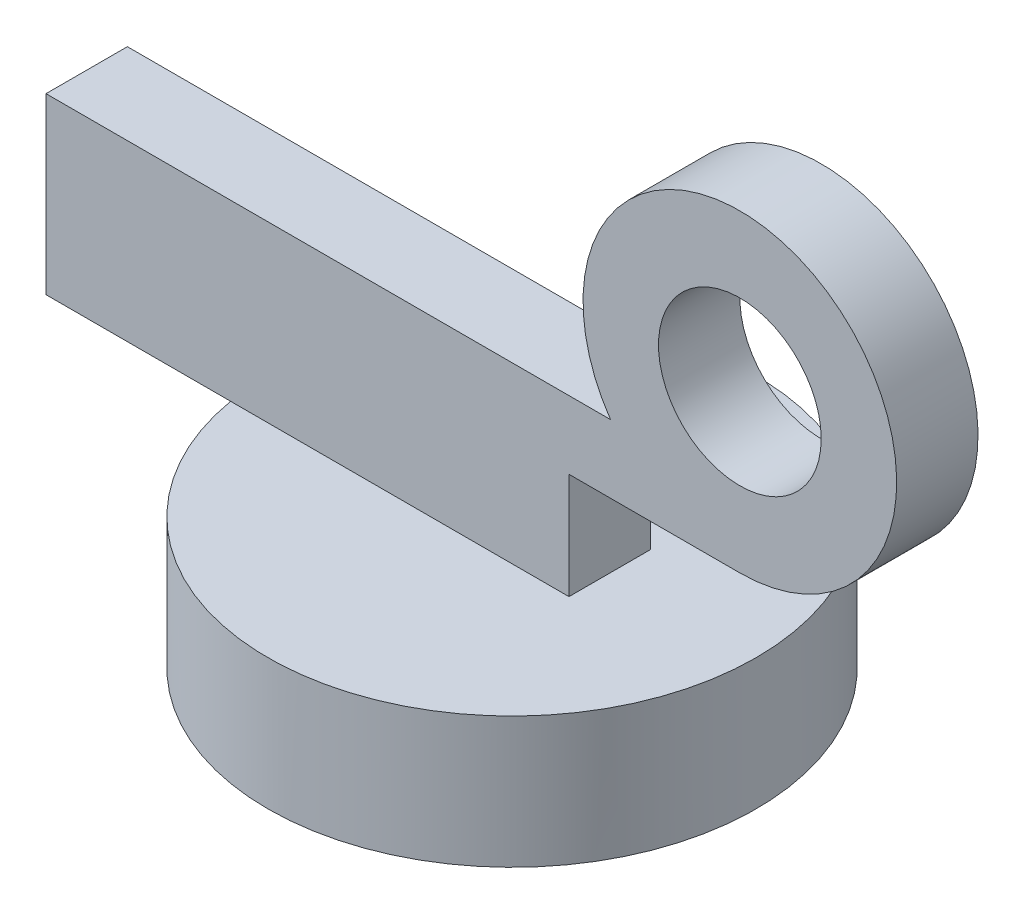
ISO-10303-21;
HEADER;
FILE_DESCRIPTION(('STEP AP214'),'2;1');
FILE_NAME('part.step','',(''),(''),'','','');
FILE_SCHEMA(('AUTOMOTIVE_DESIGN { 1 0 10303 214 1 1 1 1 }'));
ENDSEC;
DATA;
#1=APPLICATION_CONTEXT('core data for automotive mechanical design processes');
#2=APPLICATION_PROTOCOL_DEFINITION('international standard','automotive_design',2000,#1);
#3=PRODUCT_CONTEXT('',#1,'mechanical');
#4=PRODUCT('Part','Part','',(#3));
#5=PRODUCT_RELATED_PRODUCT_CATEGORY('part','',(#4));
#6=PRODUCT_DEFINITION_FORMATION('','',#4);
#7=PRODUCT_DEFINITION_CONTEXT('part definition',#1,'design');
#8=PRODUCT_DEFINITION('design','',#6,#7);
#9=PRODUCT_DEFINITION_SHAPE('','',#8);
#10=(LENGTH_UNIT() NAMED_UNIT(*) SI_UNIT(.MILLI.,.METRE.));
#11=(NAMED_UNIT(*) PLANE_ANGLE_UNIT() SI_UNIT($,.RADIAN.));
#12=(NAMED_UNIT(*) SI_UNIT($,.STERADIAN.) SOLID_ANGLE_UNIT());
#13=UNCERTAINTY_MEASURE_WITH_UNIT(LENGTH_MEASURE(1.E-05),#10,'distance_accuracy_value','');
#14=(GEOMETRIC_REPRESENTATION_CONTEXT(3) GLOBAL_UNCERTAINTY_ASSIGNED_CONTEXT((#13)) GLOBAL_UNIT_ASSIGNED_CONTEXT((#10,
#11,#12)) REPRESENTATION_CONTEXT('',''));
#15=CARTESIAN_POINT('',(0.,0.,0.));
#16=DIRECTION('',(0.,0.,1.));
#17=DIRECTION('',(1.,0.,0.));
#18=AXIS2_PLACEMENT_3D('',#15,#16,#17);
#19=CARTESIAN_POINT('',(120.,161.,50.));
#20=DIRECTION('',(-1.,0.,0.));
#21=DIRECTION('',(0.,0.,1.));
#22=AXIS2_PLACEMENT_3D('',#19,#20,#21);
#23=PLANE('',#22);
#24=DIRECTION('',(0.,0.,-1.));
#25=VECTOR('',#24,1.);
#26=CARTESIAN_POINT('',(120.,291.25,50.));
#27=LINE('',#26,#25);
#28=CARTESIAN_POINT('',(120.,291.25,50.));
#29=VERTEX_POINT('',#28);
#30=CARTESIAN_POINT('',(120.,291.25,-50.));
#31=VERTEX_POINT('',#30);
#32=EDGE_CURVE('E58',#29,#31,#27,.T.);
#33=ORIENTED_EDGE('',*,*,#32,.F.);
#34=DIRECTION('',(0.,1.,0.));
#35=VECTOR('',#34,1.);
#36=CARTESIAN_POINT('',(120.,161.,50.));
#37=LINE('',#36,#35);
#38=CARTESIAN_POINT('',(120.,161.,50.));
#39=VERTEX_POINT('',#38);
#40=EDGE_CURVE('E174',#39,#29,#37,.T.);
#41=ORIENTED_EDGE('',*,*,#40,.F.);
#42=DIRECTION('',(0.,0.,-1.));
#43=VECTOR('',#42,1.);
#44=CARTESIAN_POINT('',(120.,161.,50.));
#45=LINE('',#44,#43);
#46=CARTESIAN_POINT('',(120.,161.,-50.));
#47=VERTEX_POINT('',#46);
#48=EDGE_CURVE('E188',#39,#47,#45,.T.);
#49=ORIENTED_EDGE('',*,*,#48,.T.);
#50=DIRECTION('',(0.,1.,0.));
#51=VECTOR('',#50,1.);
#52=CARTESIAN_POINT('',(120.,161.,-50.));
#53=LINE('',#52,#51);
#54=EDGE_CURVE('E63',#47,#31,#53,.T.);
#55=ORIENTED_EDGE('',*,*,#54,.T.);
#56=EDGE_LOOP('',(#33,#41,#49,#55));
#57=FACE_BOUND('',#56,.T.);
#58=ADVANCED_FACE('F39',(#57),#23,.F.);
#59=CARTESIAN_POINT('',(0.,161.,0.));
#60=DIRECTION('',(0.,1.,0.));
#61=DIRECTION('',(0.,0.,1.));
#62=AXIS2_PLACEMENT_3D('',#59,#60,#61);
#63=PLANE('',#62);
#64=CARTESIAN_POINT('',(0.,161.,0.));
#65=DIRECTION('',(0.,1.,0.));
#66=DIRECTION('',(0.,0.,1.));
#67=AXIS2_PLACEMENT_3D('',#64,#65,#66);
#68=CIRCLE('',#67,300.);
#69=CARTESIAN_POINT('',(-295.803989154981,161.,50.));
#70=VERTEX_POINT('',#69);
#71=CARTESIAN_POINT('',(-295.803989154981,161.,-50.));
#72=VERTEX_POINT('',#71);
#73=EDGE_CURVE('E197',#70,#72,#68,.T.);
#74=ORIENTED_EDGE('',*,*,#73,.T.);
#75=DIRECTION('',(1.,0.,0.));
#76=VECTOR('',#75,1.);
#77=CARTESIAN_POINT('',(-522.75,161.,-50.));
#78=LINE('',#77,#76);
#79=EDGE_CURVE('E11',#72,#47,#78,.T.);
#80=ORIENTED_EDGE('',*,*,#79,.T.);
#81=ORIENTED_EDGE('',*,*,#48,.F.);
#82=DIRECTION('',(1.,0.,0.));
#83=VECTOR('',#82,1.);
#84=CARTESIAN_POINT('',(-522.75,161.,50.));
#85=LINE('',#84,#83);
#86=EDGE_CURVE('E49',#70,#39,#85,.T.);
#87=ORIENTED_EDGE('',*,*,#86,.F.);
#88=EDGE_LOOP('',(#74,#80,#81,#87));
#89=FACE_BOUND('',#88,.T.);
#90=ADVANCED_FACE('F220',(#89),#63,.T.);
#91=CARTESIAN_POINT('',(0.,161.,0.));
#92=DIRECTION('',(0.,-1.,0.));
#93=DIRECTION('',(0.,0.,-1.));
#94=AXIS2_PLACEMENT_3D('',#91,#92,#93);
#95=CYLINDRICAL_SURFACE('',#94,300.);
#96=EDGE_CURVE('E194',#72,#70,#68,.T.);
#97=ORIENTED_EDGE('',*,*,#96,.F.);
#98=ORIENTED_EDGE('',*,*,#73,.F.);
#99=EDGE_LOOP('',(#97,#98));
#100=FACE_BOUND('',#99,.T.);
#101=CARTESIAN_POINT('',(0.,0.,0.));
#102=DIRECTION('',(0.,1.,0.));
#103=DIRECTION('',(0.,0.,1.));
#104=AXIS2_PLACEMENT_3D('',#101,#102,#103);
#105=CIRCLE('',#104,300.);
#106=CARTESIAN_POINT('',(0.,0.,300.));
#107=VERTEX_POINT('',#106);
#108=EDGE_CURVE('E43',#107,#107,#105,.T.);
#109=ORIENTED_EDGE('',*,*,#108,.T.);
#110=EDGE_LOOP('',(#109));
#111=FACE_BOUND('',#110,.T.);
#112=ADVANCED_FACE('F41',(#100,#111),#95,.T.);
#113=CARTESIAN_POINT('',(0.,0.,0.));
#114=DIRECTION('',(0.,1.,0.));
#115=DIRECTION('',(0.,0.,1.));
#116=AXIS2_PLACEMENT_3D('',#113,#114,#115);
#117=PLANE('',#116);
#118=CARTESIAN_POINT('',(0.,0.,0.));
#119=DIRECTION('',(0.,-1.,0.));
#120=DIRECTION('',(0.,0.,-1.));
#121=AXIS2_PLACEMENT_3D('',#118,#119,#120);
#122=CIRCLE('',#121,75.);
#123=CARTESIAN_POINT('',(0.,0.,-75.));
#124=VERTEX_POINT('',#123);
#125=EDGE_CURVE('E163',#124,#124,#122,.T.);
#126=ORIENTED_EDGE('',*,*,#125,.F.);
#127=EDGE_LOOP('',(#126));
#128=FACE_BOUND('',#127,.T.);
#129=ORIENTED_EDGE('',*,*,#108,.F.);
#130=EDGE_LOOP('',(#129));
#131=FACE_BOUND('',#130,.T.);
#132=ADVANCED_FACE('F210',(#128,#131),#117,.F.);
#133=CARTESIAN_POINT('',(-522.75,161.,50.));
#134=DIRECTION('',(0.,1.,0.));
#135=DIRECTION('',(0.,0.,1.));
#136=AXIS2_PLACEMENT_3D('',#133,#134,#135);
#137=PLANE('',#136);
#138=CARTESIAN_POINT('',(-522.75,161.,-50.));
#139=VERTEX_POINT('',#138);
#140=EDGE_CURVE('E51',#139,#72,#78,.T.);
#141=ORIENTED_EDGE('',*,*,#140,.T.);
#142=ORIENTED_EDGE('',*,*,#96,.T.);
#143=CARTESIAN_POINT('',(-522.75,161.,50.));
#144=VERTEX_POINT('',#143);
#145=EDGE_CURVE('E170',#144,#70,#85,.T.);
#146=ORIENTED_EDGE('',*,*,#145,.F.);
#147=DIRECTION('',(0.,0.,-1.));
#148=VECTOR('',#147,1.);
#149=CARTESIAN_POINT('',(-522.75,161.,50.));
#150=LINE('',#149,#148);
#151=EDGE_CURVE('E191',#144,#139,#150,.T.);
#152=ORIENTED_EDGE('',*,*,#151,.T.);
#153=EDGE_LOOP('',(#141,#142,#146,#152));
#154=FACE_BOUND('',#153,.T.);
#155=ADVANCED_FACE('F212',(#154),#137,.F.);
#156=CARTESIAN_POINT('',(-522.75,161.,50.));
#157=DIRECTION('',(1.,0.,0.));
#158=DIRECTION('',(0.,0.,-1.));
#159=AXIS2_PLACEMENT_3D('',#156,#157,#158);
#160=PLANE('',#159);
#161=DIRECTION('',(0.,-1.,0.));
#162=VECTOR('',#161,1.);
#163=CARTESIAN_POINT('',(-522.75,161.,-50.));
#164=LINE('',#163,#162);
#165=CARTESIAN_POINT('',(-522.75,375.,-50.));
#166=VERTEX_POINT('',#165);
#167=EDGE_CURVE('E123',#166,#139,#164,.T.);
#168=ORIENTED_EDGE('',*,*,#167,.T.);
#169=ORIENTED_EDGE('',*,*,#151,.F.);
#170=DIRECTION('',(0.,-1.,0.));
#171=VECTOR('',#170,1.);
#172=CARTESIAN_POINT('',(-522.75,161.,50.));
#173=LINE('',#172,#171);
#174=CARTESIAN_POINT('',(-522.75,375.,50.));
#175=VERTEX_POINT('',#174);
#176=EDGE_CURVE('E125',#175,#144,#173,.T.);
#177=ORIENTED_EDGE('',*,*,#176,.F.);
#178=DIRECTION('',(0.,0.,-1.));
#179=VECTOR('',#178,1.);
#180=CARTESIAN_POINT('',(-522.75,375.,50.));
#181=LINE('',#180,#179);
#182=EDGE_CURVE('E179',#175,#166,#181,.T.);
#183=ORIENTED_EDGE('',*,*,#182,.T.);
#184=EDGE_LOOP('',(#168,#169,#177,#183));
#185=FACE_BOUND('',#184,.T.);
#186=ADVANCED_FACE('F218',(#185),#160,.F.);
#187=CARTESIAN_POINT('',(-522.75,375.,50.));
#188=DIRECTION('',(0.,-1.,0.));
#189=DIRECTION('',(0.,0.,-1.));
#190=AXIS2_PLACEMENT_3D('',#187,#188,#189);
#191=PLANE('',#190);
#192=DIRECTION('',(-1.,0.,0.));
#193=VECTOR('',#192,1.);
#194=CARTESIAN_POINT('',(-522.75,375.,-50.));
#195=LINE('',#194,#193);
#196=CARTESIAN_POINT('',(171.029680443172,375.,-50.));
#197=VERTEX_POINT('',#196);
#198=EDGE_CURVE('E105',#197,#166,#195,.T.);
#199=ORIENTED_EDGE('',*,*,#198,.T.);
#200=ORIENTED_EDGE('',*,*,#182,.F.);
#201=DIRECTION('',(-1.,0.,0.));
#202=VECTOR('',#201,1.);
#203=CARTESIAN_POINT('',(-522.75,375.,50.));
#204=LINE('',#203,#202);
#205=CARTESIAN_POINT('',(171.029680443172,375.,50.));
#206=VERTEX_POINT('',#205);
#207=EDGE_CURVE('E107',#206,#175,#204,.T.);
#208=ORIENTED_EDGE('',*,*,#207,.F.);
#209=DIRECTION('',(0.,0.,-1.));
#210=VECTOR('',#209,1.);
#211=CARTESIAN_POINT('',(171.029680443172,375.,50.));
#212=LINE('',#211,#210);
#213=EDGE_CURVE('E101',#206,#197,#212,.T.);
#214=ORIENTED_EDGE('',*,*,#213,.T.);
#215=EDGE_LOOP('',(#199,#200,#208,#214));
#216=FACE_BOUND('',#215,.T.);
#217=ADVANCED_FACE('F103',(#216),#191,.F.);
#218=CARTESIAN_POINT('',(0.,0.,50.));
#219=DIRECTION('',(0.,0.,-1.));
#220=DIRECTION('',(-1.,0.,0.));
#221=AXIS2_PLACEMENT_3D('',#218,#219,#220);
#222=PLANE('',#221);
#223=ORIENTED_EDGE('',*,*,#176,.T.);
#224=ORIENTED_EDGE('',*,*,#145,.T.);
#225=ORIENTED_EDGE('',*,*,#86,.T.);
#226=ORIENTED_EDGE('',*,*,#40,.T.);
#227=DIRECTION('',(-1.,0.,0.));
#228=VECTOR('',#227,1.);
#229=CARTESIAN_POINT('',(522.751,291.25,50.));
#230=LINE('',#229,#228);
#231=CARTESIAN_POINT('',(330.,291.25,50.));
#232=VERTEX_POINT('',#231);
#233=EDGE_CURVE('E144',#232,#29,#230,.T.);
#234=ORIENTED_EDGE('',*,*,#233,.F.);
#235=CARTESIAN_POINT('',(330.,484.,50.));
#236=DIRECTION('',(0.,0.,1.));
#237=DIRECTION('',(1.,0.,0.));
#238=AXIS2_PLACEMENT_3D('',#235,#236,#237);
#239=CIRCLE('',#238,192.75);
#240=EDGE_CURVE('E114',#232,#206,#239,.T.);
#241=ORIENTED_EDGE('',*,*,#240,.T.);
#242=ORIENTED_EDGE('',*,*,#207,.T.);
#243=EDGE_LOOP('',(#223,#224,#225,#226,#234,#241,#242));
#244=FACE_BOUND('',#243,.T.);
#245=CARTESIAN_POINT('',(330.,484.,50.));
#246=DIRECTION('',(0.,0.,1.));
#247=DIRECTION('',(1.,0.,0.));
#248=AXIS2_PLACEMENT_3D('',#245,#246,#247);
#249=CIRCLE('',#248,100.);
#250=CARTESIAN_POINT('',(430.,484.,50.));
#251=VERTEX_POINT('',#250);
#252=EDGE_CURVE('E131',#251,#251,#249,.T.);
#253=ORIENTED_EDGE('',*,*,#252,.F.);
#254=EDGE_LOOP('',(#253));
#255=FACE_BOUND('',#254,.T.);
#256=ADVANCED_FACE('F237',(#244,#255),#222,.F.);
#257=CARTESIAN_POINT('',(0.,0.,-50.));
#258=DIRECTION('',(0.,0.,-1.));
#259=DIRECTION('',(-1.,0.,0.));
#260=AXIS2_PLACEMENT_3D('',#257,#258,#259);
#261=PLANE('',#260);
#262=ORIENTED_EDGE('',*,*,#167,.F.);
#263=ORIENTED_EDGE('',*,*,#198,.F.);
#264=CARTESIAN_POINT('',(330.,484.,-50.));
#265=DIRECTION('',(0.,0.,1.));
#266=DIRECTION('',(1.,0.,0.));
#267=AXIS2_PLACEMENT_3D('',#264,#265,#266);
#268=CIRCLE('',#267,192.75);
#269=CARTESIAN_POINT('',(330.,291.25,-50.));
#270=VERTEX_POINT('',#269);
#271=EDGE_CURVE('E121',#270,#197,#268,.T.);
#272=ORIENTED_EDGE('',*,*,#271,.F.);
#273=DIRECTION('',(-1.,0.,0.));
#274=VECTOR('',#273,1.);
#275=CARTESIAN_POINT('',(522.751,291.25,-50.));
#276=LINE('',#275,#274);
#277=EDGE_CURVE('E113',#270,#31,#276,.T.);
#278=ORIENTED_EDGE('',*,*,#277,.T.);
#279=ORIENTED_EDGE('',*,*,#54,.F.);
#280=ORIENTED_EDGE('',*,*,#79,.F.);
#281=ORIENTED_EDGE('',*,*,#140,.F.);
#282=EDGE_LOOP('',(#262,#263,#272,#278,#279,#280,#281));
#283=FACE_BOUND('',#282,.T.);
#284=CARTESIAN_POINT('',(330.,484.,-50.));
#285=DIRECTION('',(0.,0.,1.));
#286=DIRECTION('',(1.,0.,0.));
#287=AXIS2_PLACEMENT_3D('',#284,#285,#286);
#288=CIRCLE('',#287,100.);
#289=CARTESIAN_POINT('',(430.,484.,-50.));
#290=VERTEX_POINT('',#289);
#291=EDGE_CURVE('E137',#290,#290,#288,.T.);
#292=ORIENTED_EDGE('',*,*,#291,.T.);
#293=EDGE_LOOP('',(#292));
#294=FACE_BOUND('',#293,.T.);
#295=ADVANCED_FACE('F119',(#283,#294),#261,.T.);
#296=CARTESIAN_POINT('',(0.,40.,0.));
#297=DIRECTION('',(0.,-1.,0.));
#298=DIRECTION('',(0.,0.,-1.));
#299=AXIS2_PLACEMENT_3D('',#296,#297,#298);
#300=CYLINDRICAL_SURFACE('',#299,75.);
#301=CARTESIAN_POINT('',(0.,40.,0.));
#302=DIRECTION('',(0.,-1.,0.));
#303=DIRECTION('',(0.,0.,-1.));
#304=AXIS2_PLACEMENT_3D('',#301,#302,#303);
#305=CIRCLE('',#304,75.);
#306=CARTESIAN_POINT('',(0.,40.,-75.));
#307=VERTEX_POINT('',#306);
#308=EDGE_CURVE('E156',#307,#307,#305,.T.);
#309=ORIENTED_EDGE('',*,*,#308,.F.);
#310=EDGE_LOOP('',(#309));
#311=FACE_BOUND('',#310,.T.);
#312=ORIENTED_EDGE('',*,*,#125,.T.);
#313=EDGE_LOOP('',(#312));
#314=FACE_BOUND('',#313,.T.);
#315=ADVANCED_FACE('F266',(#311,#314),#300,.F.);
#316=CARTESIAN_POINT('',(0.,80.,0.));
#317=DIRECTION('',(0.,-1.,0.));
#318=DIRECTION('',(0.,0.,-1.));
#319=AXIS2_PLACEMENT_3D('',#316,#317,#318);
#320=CYLINDRICAL_SURFACE('',#319,100.);
#321=CARTESIAN_POINT('',(0.,80.,0.));
#322=DIRECTION('',(0.,-1.,0.));
#323=DIRECTION('',(0.,0.,-1.));
#324=AXIS2_PLACEMENT_3D('',#321,#322,#323);
#325=CIRCLE('',#324,100.);
#326=CARTESIAN_POINT('',(0.,80.,-100.));
#327=VERTEX_POINT('',#326);
#328=EDGE_CURVE('E152',#327,#327,#325,.T.);
#329=ORIENTED_EDGE('',*,*,#328,.F.);
#330=EDGE_LOOP('',(#329));
#331=FACE_BOUND('',#330,.T.);
#332=CARTESIAN_POINT('',(0.,40.,0.));
#333=DIRECTION('',(0.,-1.,0.));
#334=DIRECTION('',(0.,0.,-1.));
#335=AXIS2_PLACEMENT_3D('',#332,#333,#334);
#336=CIRCLE('',#335,100.);
#337=CARTESIAN_POINT('',(0.,40.,-100.));
#338=VERTEX_POINT('',#337);
#339=EDGE_CURVE('E143',#338,#338,#336,.T.);
#340=ORIENTED_EDGE('',*,*,#339,.T.);
#341=EDGE_LOOP('',(#340));
#342=FACE_BOUND('',#341,.T.);
#343=ADVANCED_FACE('F261',(#331,#342),#320,.F.);
#344=CARTESIAN_POINT('',(0.,80.,0.));
#345=DIRECTION('',(0.,-1.,0.));
#346=DIRECTION('',(0.,0.,-1.));
#347=AXIS2_PLACEMENT_3D('',#344,#345,#346);
#348=PLANE('',#347);
#349=ORIENTED_EDGE('',*,*,#328,.T.);
#350=EDGE_LOOP('',(#349));
#351=FACE_BOUND('',#350,.T.);
#352=ADVANCED_FACE('F255',(#351),#348,.T.);
#353=CARTESIAN_POINT('',(0.,40.,0.));
#354=DIRECTION('',(0.,-1.,0.));
#355=DIRECTION('',(0.,0.,-1.));
#356=AXIS2_PLACEMENT_3D('',#353,#354,#355);
#357=PLANE('',#356);
#358=ORIENTED_EDGE('',*,*,#308,.T.);
#359=EDGE_LOOP('',(#358));
#360=FACE_BOUND('',#359,.T.);
#361=ORIENTED_EDGE('',*,*,#339,.F.);
#362=EDGE_LOOP('',(#361));
#363=FACE_BOUND('',#362,.T.);
#364=ADVANCED_FACE('F247',(#360,#363),#357,.F.);
#365=CARTESIAN_POINT('',(522.751,291.25,50.));
#366=DIRECTION('',(0.,1.,0.));
#367=DIRECTION('',(0.,0.,1.));
#368=AXIS2_PLACEMENT_3D('',#365,#366,#367);
#369=PLANE('',#368);
#370=ORIENTED_EDGE('',*,*,#277,.F.);
#371=DIRECTION('',(0.,0.,-1.));
#372=VECTOR('',#371,1.);
#373=CARTESIAN_POINT('',(330.,291.25,50.));
#374=LINE('',#373,#372);
#375=EDGE_CURVE('E129',#270,#232,#374,.F.);
#376=ORIENTED_EDGE('',*,*,#375,.T.);
#377=ORIENTED_EDGE('',*,*,#233,.T.);
#378=ORIENTED_EDGE('',*,*,#32,.T.);
#379=EDGE_LOOP('',(#370,#376,#377,#378));
#380=FACE_BOUND('',#379,.T.);
#381=ADVANCED_FACE('F244',(#380),#369,.F.);
#382=CARTESIAN_POINT('',(330.,484.,50.));
#383=DIRECTION('',(0.,0.,-1.));
#384=DIRECTION('',(-1.,0.,0.));
#385=AXIS2_PLACEMENT_3D('',#382,#383,#384);
#386=CYLINDRICAL_SURFACE('',#385,192.75);
#387=ORIENTED_EDGE('',*,*,#271,.T.);
#388=ORIENTED_EDGE('',*,*,#213,.F.);
#389=ORIENTED_EDGE('',*,*,#240,.F.);
#390=ORIENTED_EDGE('',*,*,#375,.F.);
#391=EDGE_LOOP('',(#387,#388,#389,#390));
#392=FACE_BOUND('',#391,.T.);
#393=ADVANCED_FACE('F128',(#392),#386,.T.);
#394=CARTESIAN_POINT('',(330.,484.,50.));
#395=DIRECTION('',(0.,0.,-1.));
#396=DIRECTION('',(-1.,0.,0.));
#397=AXIS2_PLACEMENT_3D('',#394,#395,#396);
#398=CYLINDRICAL_SURFACE('',#397,100.);
#399=ORIENTED_EDGE('',*,*,#252,.T.);
#400=EDGE_LOOP('',(#399));
#401=FACE_BOUND('',#400,.T.);
#402=ORIENTED_EDGE('',*,*,#291,.F.);
#403=EDGE_LOOP('',(#402));
#404=FACE_BOUND('',#403,.T.);
#405=ADVANCED_FACE('F253',(#401,#404),#398,.F.);
#406=CLOSED_SHELL('',(#58,#90,#112,#132,#155,#186,#217,#256,#295,#315,#343,#352,#364,#381,#393,#405));
#407=MANIFOLD_SOLID_BREP('B2',#406);
#408=ADVANCED_BREP_SHAPE_REPRESENTATION('',(#18,#407),#14);
#409=SHAPE_DEFINITION_REPRESENTATION(#9,#408);
ENDSEC;
END-ISO-10303-21;
